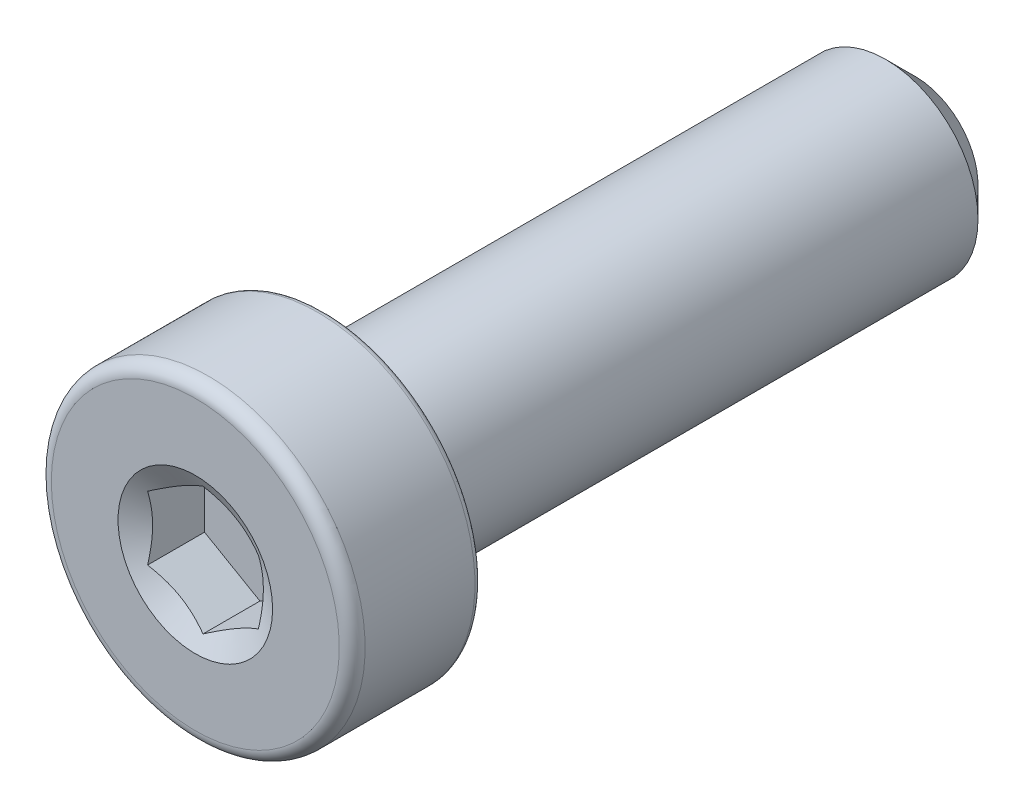
ISO-10303-21;
HEADER;
FILE_DESCRIPTION(('STEP AP214'),'2;1');
FILE_NAME('part.step','',(''),(''),'','','');
FILE_SCHEMA(('AUTOMOTIVE_DESIGN { 1 0 10303 214 1 1 1 1 }'));
ENDSEC;
DATA;
#1=APPLICATION_CONTEXT('core data for automotive mechanical design processes');
#2=APPLICATION_PROTOCOL_DEFINITION('international standard','automotive_design',2000,#1);
#3=PRODUCT_CONTEXT('',#1,'mechanical');
#4=PRODUCT('Part','Part','',(#3));
#5=PRODUCT_RELATED_PRODUCT_CATEGORY('part','',(#4));
#6=PRODUCT_DEFINITION_FORMATION('','',#4);
#7=PRODUCT_DEFINITION_CONTEXT('part definition',#1,'design');
#8=PRODUCT_DEFINITION('design','',#6,#7);
#9=PRODUCT_DEFINITION_SHAPE('','',#8);
#10=(LENGTH_UNIT() NAMED_UNIT(*) SI_UNIT(.MILLI.,.METRE.));
#11=(NAMED_UNIT(*) PLANE_ANGLE_UNIT() SI_UNIT($,.RADIAN.));
#12=(NAMED_UNIT(*) SI_UNIT($,.STERADIAN.) SOLID_ANGLE_UNIT());
#13=UNCERTAINTY_MEASURE_WITH_UNIT(LENGTH_MEASURE(1.E-05),#10,'distance_accuracy_value','');
#14=(GEOMETRIC_REPRESENTATION_CONTEXT(3) GLOBAL_UNCERTAINTY_ASSIGNED_CONTEXT((#13)) GLOBAL_UNIT_ASSIGNED_CONTEXT((#10,
#11,#12)) REPRESENTATION_CONTEXT('',''));
#15=CARTESIAN_POINT('',(0.,0.,0.));
#16=DIRECTION('',(0.,0.,1.));
#17=DIRECTION('',(1.,0.,0.));
#18=AXIS2_PLACEMENT_3D('',#15,#16,#17);
#19=CARTESIAN_POINT('',(0.,0.,-9.75));
#20=DIRECTION('',(0.,0.,-1.));
#21=DIRECTION('',(-1.,0.,0.));
#22=AXIS2_PLACEMENT_3D('',#19,#20,#21);
#23=PLANE('',#22);
#24=CARTESIAN_POINT('',(0.,0.,-9.75));
#25=DIRECTION('',(0.,0.,-1.));
#26=DIRECTION('',(-1.,0.,0.));
#27=AXIS2_PLACEMENT_3D('',#24,#25,#26);
#28=CIRCLE('',#27,1.7);
#29=CARTESIAN_POINT('',(-1.7,0.,-9.75));
#30=VERTEX_POINT('',#29);
#31=EDGE_CURVE('E48',#30,#30,#28,.T.);
#32=ORIENTED_EDGE('',*,*,#31,.T.);
#33=EDGE_LOOP('',(#32));
#34=FACE_BOUND('',#33,.T.);
#35=ADVANCED_FACE('F35',(#34),#23,.T.);
#36=CARTESIAN_POINT('',(0.,0.,-9.75));
#37=DIRECTION('',(0.,0.,1.));
#38=DIRECTION('',(1.,0.,0.));
#39=AXIS2_PLACEMENT_3D('',#36,#37,#38);
#40=CONICAL_SURFACE('',#39,1.7,0.785398163397449);
#41=CARTESIAN_POINT('',(0.,0.,-8.95));
#42=DIRECTION('',(0.,0.,-1.));
#43=DIRECTION('',(-1.,0.,0.));
#44=AXIS2_PLACEMENT_3D('',#41,#42,#43);
#45=CIRCLE('',#44,2.5);
#46=CARTESIAN_POINT('',(-2.5,0.,-8.95));
#47=VERTEX_POINT('',#46);
#48=EDGE_CURVE('E133',#47,#47,#45,.T.);
#49=ORIENTED_EDGE('',*,*,#48,.T.);
#50=EDGE_LOOP('',(#49));
#51=FACE_BOUND('',#50,.T.);
#52=ORIENTED_EDGE('',*,*,#31,.F.);
#53=EDGE_LOOP('',(#52));
#54=FACE_BOUND('',#53,.T.);
#55=ADVANCED_FACE('F139',(#51,#54),#40,.T.);
#56=CARTESIAN_POINT('',(0.,0.,-9.75));
#57=DIRECTION('',(0.,0.,-1.));
#58=DIRECTION('',(-1.,0.,0.));
#59=AXIS2_PLACEMENT_3D('',#56,#57,#58);
#60=CYLINDRICAL_SURFACE('',#59,2.5);
#61=CARTESIAN_POINT('',(0.,0.,6.25));
#62=DIRECTION('',(0.,0.,-1.));
#63=DIRECTION('',(-1.,0.,0.));
#64=AXIS2_PLACEMENT_3D('',#61,#62,#63);
#65=CIRCLE('',#64,2.5);
#66=CARTESIAN_POINT('',(-2.5,0.,6.25));
#67=VERTEX_POINT('',#66);
#68=EDGE_CURVE('E130',#67,#67,#65,.T.);
#69=ORIENTED_EDGE('',*,*,#68,.T.);
#70=EDGE_LOOP('',(#69));
#71=FACE_BOUND('',#70,.T.);
#72=ORIENTED_EDGE('',*,*,#48,.F.);
#73=EDGE_LOOP('',(#72));
#74=FACE_BOUND('',#73,.T.);
#75=ADVANCED_FACE('F141',(#71,#74),#60,.T.);
#76=CARTESIAN_POINT('',(0.,2.5,6.25));
#77=DIRECTION('',(0.,0.,-1.));
#78=DIRECTION('',(-1.,0.,0.));
#79=AXIS2_PLACEMENT_3D('',#76,#77,#78);
#80=PLANE('',#79);
#81=CARTESIAN_POINT('',(0.,0.,6.25));
#82=DIRECTION('',(0.,0.,-1.));
#83=DIRECTION('',(-1.,0.,0.));
#84=AXIS2_PLACEMENT_3D('',#81,#82,#83);
#85=CIRCLE('',#84,4.075);
#86=CARTESIAN_POINT('',(-4.075,0.,6.25));
#87=VERTEX_POINT('',#86);
#88=EDGE_CURVE('E127',#87,#87,#85,.T.);
#89=ORIENTED_EDGE('',*,*,#88,.T.);
#90=EDGE_LOOP('',(#89));
#91=FACE_BOUND('',#90,.T.);
#92=ORIENTED_EDGE('',*,*,#68,.F.);
#93=EDGE_LOOP('',(#92));
#94=FACE_BOUND('',#93,.T.);
#95=ADVANCED_FACE('F147',(#91,#94),#80,.T.);
#96=CARTESIAN_POINT('',(0.,0.,6.425));
#97=DIRECTION('',(0.,0.,-1.));
#98=DIRECTION('',(-1.,0.,0.));
#99=AXIS2_PLACEMENT_3D('',#96,#97,#98);
#100=TOROIDAL_SURFACE('',#99,4.075,0.175);
#101=CARTESIAN_POINT('',(0.,0.,6.425));
#102=DIRECTION('',(0.,0.,-1.));
#103=DIRECTION('',(-1.,0.,0.));
#104=AXIS2_PLACEMENT_3D('',#101,#102,#103);
#105=CIRCLE('',#104,4.25);
#106=CARTESIAN_POINT('',(-4.25,0.,6.425));
#107=VERTEX_POINT('',#106);
#108=EDGE_CURVE('E124',#107,#107,#105,.T.);
#109=ORIENTED_EDGE('',*,*,#108,.T.);
#110=EDGE_LOOP('',(#109));
#111=FACE_BOUND('',#110,.T.);
#112=ORIENTED_EDGE('',*,*,#88,.F.);
#113=EDGE_LOOP('',(#112));
#114=FACE_BOUND('',#113,.T.);
#115=ADVANCED_FACE('F153',(#111,#114),#100,.T.);
#116=CARTESIAN_POINT('',(0.,0.,-9.75));
#117=DIRECTION('',(0.,0.,-1.));
#118=DIRECTION('',(-1.,0.,0.));
#119=AXIS2_PLACEMENT_3D('',#116,#117,#118);
#120=CYLINDRICAL_SURFACE('',#119,4.25);
#121=CARTESIAN_POINT('',(0.,0.,9.4));
#122=DIRECTION('',(0.,0.,-1.));
#123=DIRECTION('',(-1.,0.,0.));
#124=AXIS2_PLACEMENT_3D('',#121,#122,#123);
#125=CIRCLE('',#124,4.25);
#126=CARTESIAN_POINT('',(-4.25,0.,9.4));
#127=VERTEX_POINT('',#126);
#128=EDGE_CURVE('E121',#127,#127,#125,.T.);
#129=ORIENTED_EDGE('',*,*,#128,.T.);
#130=EDGE_LOOP('',(#129));
#131=FACE_BOUND('',#130,.T.);
#132=ORIENTED_EDGE('',*,*,#108,.F.);
#133=EDGE_LOOP('',(#132));
#134=FACE_BOUND('',#133,.T.);
#135=ADVANCED_FACE('F157',(#131,#134),#120,.T.);
#136=CARTESIAN_POINT('',(0.,0.,9.4));
#137=DIRECTION('',(0.,0.,-1.));
#138=DIRECTION('',(-1.,0.,0.));
#139=AXIS2_PLACEMENT_3D('',#136,#137,#138);
#140=TOROIDAL_SURFACE('',#139,3.9,0.35);
#141=CARTESIAN_POINT('',(0.,0.,9.75));
#142=DIRECTION('',(0.,0.,-1.));
#143=DIRECTION('',(-1.,0.,0.));
#144=AXIS2_PLACEMENT_3D('',#141,#142,#143);
#145=CIRCLE('',#144,3.9);
#146=CARTESIAN_POINT('',(-3.9,0.,9.75));
#147=VERTEX_POINT('',#146);
#148=EDGE_CURVE('E118',#147,#147,#145,.T.);
#149=ORIENTED_EDGE('',*,*,#148,.T.);
#150=EDGE_LOOP('',(#149));
#151=FACE_BOUND('',#150,.T.);
#152=ORIENTED_EDGE('',*,*,#128,.F.);
#153=EDGE_LOOP('',(#152));
#154=FACE_BOUND('',#153,.T.);
#155=ADVANCED_FACE('F161',(#151,#154),#140,.T.);
#156=CARTESIAN_POINT('',(0.,3.9,9.75));
#157=DIRECTION('',(0.,0.,1.));
#158=DIRECTION('',(1.,0.,0.));
#159=AXIS2_PLACEMENT_3D('',#156,#157,#158);
#160=PLANE('',#159);
#161=CARTESIAN_POINT('',(0.,0.,9.75));
#162=DIRECTION('',(0.,0.,1.));
#163=DIRECTION('',(1.,0.,0.));
#164=AXIS2_PLACEMENT_3D('',#161,#162,#163);
#165=CIRCLE('',#164,2.09337567297406);
#166=CARTESIAN_POINT('',(2.09337567297406,0.,9.75));
#167=VERTEX_POINT('',#166);
#168=EDGE_CURVE('E255',#167,#167,#165,.T.);
#169=ORIENTED_EDGE('',*,*,#168,.F.);
#170=EDGE_LOOP('',(#169));
#171=FACE_BOUND('',#170,.T.);
#172=ORIENTED_EDGE('',*,*,#148,.F.);
#173=EDGE_LOOP('',(#172));
#174=FACE_BOUND('',#173,.T.);
#175=ADVANCED_FACE('F165',(#171,#174),#160,.T.);
#176=CARTESIAN_POINT('',(0.,0.,9.75));
#177=DIRECTION('',(0.,0.,1.));
#178=DIRECTION('',(1.,0.,0.));
#179=AXIS2_PLACEMENT_3D('',#176,#177,#178);
#180=CONICAL_SURFACE('',#179,2.09337567297406,1.0471975511966);
#181=ORIENTED_EDGE('',*,*,#168,.T.);
#182=EDGE_LOOP('',(#181));
#183=FACE_BOUND('',#182,.T.);
#184=CARTESIAN_POINT('',(1.5002,0.865909933730598,9.5414556650263));
#185=CARTESIAN_POINT('',(1.43428070889745,0.903968454193443,9.51947184824703));
#186=CARTESIAN_POINT('',(1.36779241087776,0.94235549095307,9.49947788115967));
#187=CARTESIAN_POINT('',(1.23366433933493,1.01979436916421,9.46457709266235));
#188=CARTESIAN_POINT('',(1.16602218135311,1.05884758728358,9.44968261980102));
#189=CARTESIAN_POINT('',(1.03157622213015,1.13646999803241,9.42649567278809));
#190=CARTESIAN_POINT('',(0.964793115072749,1.17502724286932,9.41804890318966));
#191=CARTESIAN_POINT('',(0.830912431610117,1.25232329150576,9.4079625689897));
#192=CARTESIAN_POINT('',(0.763815342295619,1.29106181408333,9.40631465483574));
#193=CARTESIAN_POINT('',(0.638425268170802,1.363455807133,9.40973061453095));
#194=CARTESIAN_POINT('',(0.580113576780178,1.39712207785428,9.41395575070183));
#195=CARTESIAN_POINT('',(0.463870120461215,1.46423526865157,9.42735076691052));
#196=CARTESIAN_POINT('',(0.405938758031212,1.49768195634505,9.4365252290937));
#197=CARTESIAN_POINT('',(0.289455348660845,1.56493368410116,9.45946217543284));
#198=CARTESIAN_POINT('',(0.230918055453305,1.59873020609216,9.47332195363929));
#199=CARTESIAN_POINT('',(0.114716876613637,1.6658189879754,9.5047787757145));
#200=CARTESIAN_POINT('',(0.0570515005961863,1.69911210834199,9.52236842136746));
#201=CARTESIAN_POINT('',(-0.000200000000003103,1.73216627762271,9.5414556650263));
#202=B_SPLINE_CURVE_WITH_KNOTS('',3,(#184,#185,#186,#187,#188,#189,#190,#191,#192,#193,#194,
#195,#196,#197,#198,#199,#200,#201),.UNSPECIFIED.,.F.,.F.,(4,2,2,2,2,2,2,2,4),(0.,
0.237777822177383,0.476127422841917,0.708577067230588,0.940741159251577,1.1429435283589,
1.34533342091875,1.55221450553907,1.75868901573748),.UNSPECIFIED.);
#203=CARTESIAN_POINT('',(1.5,0.866025403784436,9.54138899169341));
#204=VERTEX_POINT('',#203);
#205=CARTESIAN_POINT('',(0.,1.73205080756887,9.54138899169341));
#206=VERTEX_POINT('',#205);
#207=EDGE_CURVE('E102',#204,#206,#202,.T.);
#208=ORIENTED_EDGE('',*,*,#207,.F.);
#209=CARTESIAN_POINT('',(1.5,-2.28946890925631,10.121649295826));
#210=CARTESIAN_POINT('',(1.5,-2.22422955711001,10.0901521310091));
#211=CARTESIAN_POINT('',(1.5,-2.15883649737623,10.0589680101354));
#212=CARTESIAN_POINT('',(1.5,-2.02766070628189,9.99740257185953));
#213=CARTESIAN_POINT('',(1.5,-1.9618779118326,9.96702138903554));
#214=CARTESIAN_POINT('',(1.5,-1.82948367590071,9.907077827651));
#215=CARTESIAN_POINT('',(1.5,-1.76286964590902,9.87752114149355));
#216=CARTESIAN_POINT('',(1.5,-1.62909941599885,9.81966908411551));
#217=CARTESIAN_POINT('',(1.5,-1.56194324309754,9.79137365049432));
#218=CARTESIAN_POINT('',(1.5,-1.42500619524527,9.73557186598219));
#219=CARTESIAN_POINT('',(1.5,-1.35520588699246,9.70811258401843));
#220=CARTESIAN_POINT('',(1.5,-1.21478957942829,9.65537265073154));
#221=CARTESIAN_POINT('',(1.5,-1.14417348125658,9.63009226666336));
#222=CARTESIAN_POINT('',(1.5,-0.931191801085829,9.55853146254348));
#223=CARTESIAN_POINT('',(1.5,-0.78732497371264,9.51637475335477));
#224=CARTESIAN_POINT('',(1.5,-0.568772700575271,9.46678689450771));
#225=CARTESIAN_POINT('',(1.5,-0.495640345793815,9.45254991631158));
#226=CARTESIAN_POINT('',(1.5,-0.348502307838471,9.4295406040777));
#227=CARTESIAN_POINT('',(1.5,-0.274496701711071,9.42076779155903));
#228=CARTESIAN_POINT('',(1.5,-0.126935601798651,9.40949855709945));
#229=CARTESIAN_POINT('',(1.5,-0.0533862078859922,9.40692435065547));
#230=CARTESIAN_POINT('',(1.5,0.0936622716385084,9.40806052572912));
#231=CARTESIAN_POINT('',(1.5,0.167161354670854,9.41177120839138));
#232=CARTESIAN_POINT('',(1.5,0.3456803821271,9.42808971368353));
#233=CARTESIAN_POINT('',(1.5,0.450410514958657,9.44388185355354));
#234=CARTESIAN_POINT('',(1.5,0.657891969531223,9.48536431192958));
#235=CARTESIAN_POINT('',(1.5,0.760641207833833,9.5110645123585));
#236=CARTESIAN_POINT('',(1.5,0.966381168392539,9.57026308478443));
#237=CARTESIAN_POINT('',(1.5,1.06932296555729,9.60392740339232));
#238=CARTESIAN_POINT('',(1.5,1.22230709351192,9.65829438908344));
#239=CARTESIAN_POINT('',(1.5,1.27305783511732,9.67705937268821));
#240=CARTESIAN_POINT('',(1.5,1.3741450115088,9.71567408725896));
#241=CARTESIAN_POINT('',(1.5,1.42448145444113,9.73552379683731));
#242=CARTESIAN_POINT('',(1.5,1.55744748680979,9.789340075099));
#243=CARTESIAN_POINT('',(1.5,1.63976225916663,9.82408262117661));
#244=CARTESIAN_POINT('',(1.5,1.80359465969967,9.89540460375299));
#245=CARTESIAN_POINT('',(1.5,1.88511221645997,9.9319842030495));
#246=CARTESIAN_POINT('',(1.5,2.12875959775541,10.0438112389649));
#247=CARTESIAN_POINT('',(1.5,2.28993757004672,10.1211274275682));
#248=CARTESIAN_POINT('',(1.5,2.61086725627019,10.2791741391286));
#249=CARTESIAN_POINT('',(1.5,2.77061667904916,10.3599092539195));
#250=CARTESIAN_POINT('',(1.5,3.08897798625638,10.5235199736269));
#251=CARTESIAN_POINT('',(1.5,3.24759006455736,10.606395202095));
#252=CARTESIAN_POINT('',(1.5,3.5480498977071,10.7651540242879));
#253=CARTESIAN_POINT('',(1.5,3.68997184700446,10.8408977245038));
#254=CARTESIAN_POINT('',(1.5,3.97335824337872,10.9932529754136));
#255=CARTESIAN_POINT('',(1.5,4.11482266639993,11.0698645708157));
#256=CARTESIAN_POINT('',(1.5,4.39699015625816,11.2235102288952));
#257=CARTESIAN_POINT('',(1.5,4.53769424143924,11.300542423984));
#258=CARTESIAN_POINT('',(1.5,4.81881695253546,11.4551037850255));
#259=CARTESIAN_POINT('',(1.5,4.95923559704223,11.5326329171499));
#260=CARTESIAN_POINT('',(1.5,5.09955320664059,11.6103433688583));
#261=B_SPLINE_CURVE_WITH_KNOTS('',3,(#209,#210,#211,#212,#213,#214,#215,#216,#217,#218,#219,
#220,#221,#222,#223,#224,#225,#226,#227,#228,#229,#230,#231,#232,#233,#234,#235,#236,#237,#238,
#239,#240,#241,#242,#243,#244,#245,#246,#247,#248,#249,#250,#251,#252,#253,#254,#255,#256,#257,
#258,#259,#260),.UNSPECIFIED.,.F.,.F.,(4,2,2,2,2,2,2,2,2,2,2,2,2,2,2,2,2,2,2,2,2,2,2,2,2,4),(0.,
0.217336850893779,0.434709900924588,0.653329085678124,0.871937442191075,1.09692037438618,
1.32193086293911,1.77075409579344,1.99410639403826,2.21743913122937,2.43795438114542,
2.65848019749464,2.97556672594526,3.29297032602481,3.61768304073655,3.78000129827247,
3.94231635651881,4.2103230246926,4.47835348539217,5.01456574112281,5.55152254280808,
6.0883855280323,6.5709902154558,7.05361987753442,7.53485095488151,8.01604961375129),.UNSPECIFIED.);
#262=CARTESIAN_POINT('',(1.5,-0.866025403784437,9.54138899169341));
#263=VERTEX_POINT('',#262);
#264=EDGE_CURVE('E211',#263,#204,#261,.T.);
#265=ORIENTED_EDGE('',*,*,#264,.F.);
#266=CARTESIAN_POINT('',(-0.000200000000001783,-1.73216627762271,9.5414556650263));
#267=CARTESIAN_POINT('',(0.0657192911025457,-1.69410775715987,9.51947184824703));
#268=CARTESIAN_POINT('',(0.132207589122233,-1.65572072040024,9.49947788115967));
#269=CARTESIAN_POINT('',(0.266335660665068,-1.5782818421891,9.46457709266236));
#270=CARTESIAN_POINT('',(0.333977818646884,-1.53922862406973,9.44968261980102));
#271=CARTESIAN_POINT('',(0.468423777869841,-1.4616062133209,9.42649567278809));
#272=CARTESIAN_POINT('',(0.535206884927245,-1.42304896848399,9.41804890318966));
#273=CARTESIAN_POINT('',(0.669087568389878,-1.34575291984755,9.4079625689897));
#274=CARTESIAN_POINT('',(0.736184657704376,-1.30701439726998,9.40631465483574));
#275=CARTESIAN_POINT('',(0.861574731829192,-1.23462040422031,9.40973061453095));
#276=CARTESIAN_POINT('',(0.919886423219816,-1.20095413349903,9.41395575070183));
#277=CARTESIAN_POINT('',(1.03612987953878,-1.13384094270174,9.42735076691052));
#278=CARTESIAN_POINT('',(1.09406124196878,-1.10039425500826,9.4365252290937));
#279=CARTESIAN_POINT('',(1.21054465133915,-1.03314252725215,9.45946217543284));
#280=CARTESIAN_POINT('',(1.26908194454669,-0.99934600526115,9.47332195363929));
#281=CARTESIAN_POINT('',(1.38528312338636,-0.932257223377916,9.5047787757145));
#282=CARTESIAN_POINT('',(1.44294849940381,-0.89896410301132,9.52236842136746));
#283=CARTESIAN_POINT('',(1.5002,-0.865909933730599,9.5414556650263));
#284=B_SPLINE_CURVE_WITH_KNOTS('',3,(#266,#267,#268,#269,#270,#271,#272,#273,#274,#275,#276,
#277,#278,#279,#280,#281,#282,#283),.UNSPECIFIED.,.F.,.F.,(4,2,2,2,2,2,2,2,4),(0.,
0.237777822177383,0.476127422841918,0.708577067230589,0.940741159251579,1.1429435283589,
1.34533342091875,1.55221450553907,1.75868901573748),.UNSPECIFIED.);
#285=CARTESIAN_POINT('',(0.,-1.73205080756888,9.54138899169341));
#286=VERTEX_POINT('',#285);
#287=EDGE_CURVE('E205',#286,#263,#284,.T.);
#288=ORIENTED_EDGE('',*,*,#287,.F.);
#289=CARTESIAN_POINT('',(-1.5002,-0.865909933730601,9.5414556650263));
#290=CARTESIAN_POINT('',(-1.43428070889745,-0.903968454193446,9.51947184824703));
#291=CARTESIAN_POINT('',(-1.36779241087776,-0.942355490953073,9.49947788115967));
#292=CARTESIAN_POINT('',(-1.23366433933493,-1.01979436916421,9.46457709266236));
#293=CARTESIAN_POINT('',(-1.16602218135311,-1.05884758728358,9.44968261980102));
#294=CARTESIAN_POINT('',(-1.03157622213015,-1.13646999803241,9.42649567278809));
#295=CARTESIAN_POINT('',(-0.96479311507275,-1.17502724286933,9.41804890318967));
#296=CARTESIAN_POINT('',(-0.830912431610117,-1.25232329150577,9.4079625689897));
#297=CARTESIAN_POINT('',(-0.763815342295619,-1.29106181408333,9.40631465483574));
#298=CARTESIAN_POINT('',(-0.638425268170803,-1.363455807133,9.40973061453096));
#299=CARTESIAN_POINT('',(-0.580113576780179,-1.39712207785428,9.41395575070183));
#300=CARTESIAN_POINT('',(-0.463870120461216,-1.46423526865157,9.42735076691052));
#301=CARTESIAN_POINT('',(-0.405938758031214,-1.49768195634505,9.4365252290937));
#302=CARTESIAN_POINT('',(-0.289455348660848,-1.56493368410116,9.45946217543285));
#303=CARTESIAN_POINT('',(-0.230918055453309,-1.59873020609216,9.4733219536393));
#304=CARTESIAN_POINT('',(-0.114716876613641,-1.6658189879754,9.50477877571451));
#305=CARTESIAN_POINT('',(-0.0570515005961911,-1.69911210834199,9.52236842136747));
#306=CARTESIAN_POINT('',(0.000199999999998025,-1.73216627762271,9.5414556650263));
#307=B_SPLINE_CURVE_WITH_KNOTS('',3,(#289,#290,#291,#292,#293,#294,#295,#296,#297,#298,#299,
#300,#301,#302,#303,#304,#305,#306),.UNSPECIFIED.,.F.,.F.,(4,2,2,2,2,2,2,2,4),(0.,
0.237777822177383,0.476127422841918,0.708577067230589,0.940741159251579,1.1429435283589,
1.34533342091875,1.55221450553907,1.75868901573747),.UNSPECIFIED.);
#308=CARTESIAN_POINT('',(-1.5,-0.866025403784439,9.54138899169341));
#309=VERTEX_POINT('',#308);
#310=EDGE_CURVE('E55',#309,#286,#307,.T.);
#311=ORIENTED_EDGE('',*,*,#310,.F.);
#312=CARTESIAN_POINT('',(-1.5,-2.28946890925632,10.121649295826));
#313=CARTESIAN_POINT('',(-1.5,-2.22422955711001,10.0901521310091));
#314=CARTESIAN_POINT('',(-1.5,-2.15883649737623,10.0589680101354));
#315=CARTESIAN_POINT('',(-1.5,-2.02766070628189,9.99740257185953));
#316=CARTESIAN_POINT('',(-1.5,-1.9618779118326,9.96702138903554));
#317=CARTESIAN_POINT('',(-1.5,-1.82948367590071,9.907077827651));
#318=CARTESIAN_POINT('',(-1.5,-1.76286964590902,9.87752114149355));
#319=CARTESIAN_POINT('',(-1.5,-1.62909941599885,9.81966908411552));
#320=CARTESIAN_POINT('',(-1.5,-1.56194324309754,9.79137365049433));
#321=CARTESIAN_POINT('',(-1.5,-1.42500619524527,9.73557186598219));
#322=CARTESIAN_POINT('',(-1.5,-1.35520588699246,9.70811258401843));
#323=CARTESIAN_POINT('',(-1.5,-1.21478957942829,9.65537265073154));
#324=CARTESIAN_POINT('',(-1.5,-1.14417348125658,9.63009226666336));
#325=CARTESIAN_POINT('',(-1.5,-0.931191801085829,9.55853146254348));
#326=CARTESIAN_POINT('',(-1.5,-0.787324973712641,9.51637475335477));
#327=CARTESIAN_POINT('',(-1.5,-0.568772700575272,9.46678689450771));
#328=CARTESIAN_POINT('',(-1.5,-0.495640345793815,9.45254991631159));
#329=CARTESIAN_POINT('',(-1.5,-0.348502307838472,9.4295406040777));
#330=CARTESIAN_POINT('',(-1.5,-0.274496701711071,9.42076779155903));
#331=CARTESIAN_POINT('',(-1.5,-0.126935601798652,9.40949855709945));
#332=CARTESIAN_POINT('',(-1.5,-0.0533862078859932,9.40692435065547));
#333=CARTESIAN_POINT('',(-1.5,0.0936622716385074,9.40806052572913));
#334=CARTESIAN_POINT('',(-1.5,0.167161354670853,9.41177120839138));
#335=CARTESIAN_POINT('',(-1.5,0.345680382127099,9.42808971368353));
#336=CARTESIAN_POINT('',(-1.5,0.450410514958656,9.44388185355354));
#337=CARTESIAN_POINT('',(-1.5,0.657891969531223,9.48536431192959));
#338=CARTESIAN_POINT('',(-1.5,0.760641207833833,9.5110645123585));
#339=CARTESIAN_POINT('',(-1.5,0.96638116839254,9.57026308478444));
#340=CARTESIAN_POINT('',(-1.5,1.06932296555729,9.60392740339232));
#341=CARTESIAN_POINT('',(-1.5,1.22230709351192,9.65829438908344));
#342=CARTESIAN_POINT('',(-1.5,1.27305783511733,9.67705937268821));
#343=CARTESIAN_POINT('',(-1.5,1.3741450115088,9.71567408725896));
#344=CARTESIAN_POINT('',(-1.5,1.42448145444114,9.73552379683731));
#345=CARTESIAN_POINT('',(-1.5,1.55744748680979,9.789340075099));
#346=CARTESIAN_POINT('',(-1.5,1.63976225916663,9.82408262117661));
#347=CARTESIAN_POINT('',(-1.5,1.80359465969967,9.89540460375299));
#348=CARTESIAN_POINT('',(-1.5,1.88511221645997,9.9319842030495));
#349=CARTESIAN_POINT('',(-1.5,2.12875959775541,10.0438112389649));
#350=CARTESIAN_POINT('',(-1.5,2.28993757004672,10.1211274275682));
#351=CARTESIAN_POINT('',(-1.5,2.61086725627019,10.2791741391286));
#352=CARTESIAN_POINT('',(-1.5,2.77061667904916,10.3599092539195));
#353=CARTESIAN_POINT('',(-1.5,3.08897798625638,10.5235199736269));
#354=CARTESIAN_POINT('',(-1.5,3.24759006455736,10.6063952020951));
#355=CARTESIAN_POINT('',(-1.5,3.5480498977071,10.7651540242879));
#356=CARTESIAN_POINT('',(-1.5,3.68997184700446,10.8408977245038));
#357=CARTESIAN_POINT('',(-1.5,3.97335824337872,10.9932529754136));
#358=CARTESIAN_POINT('',(-1.5,4.11482266639993,11.0698645708157));
#359=CARTESIAN_POINT('',(-1.5,4.39699015625816,11.2235102288953));
#360=CARTESIAN_POINT('',(-1.5,4.53769424143925,11.300542423984));
#361=CARTESIAN_POINT('',(-1.5,4.81881695253546,11.4551037850255));
#362=CARTESIAN_POINT('',(-1.5,4.95923559704223,11.5326329171499));
#363=CARTESIAN_POINT('',(-1.5,5.0995532066406,11.6103433688583));
#364=B_SPLINE_CURVE_WITH_KNOTS('',3,(#312,#313,#314,#315,#316,#317,#318,#319,#320,#321,#322,
#323,#324,#325,#326,#327,#328,#329,#330,#331,#332,#333,#334,#335,#336,#337,#338,#339,#340,#341,
#342,#343,#344,#345,#346,#347,#348,#349,#350,#351,#352,#353,#354,#355,#356,#357,#358,#359,#360,
#361,#362,#363),.UNSPECIFIED.,.F.,.F.,(4,2,2,2,2,2,2,2,2,2,2,2,2,2,2,2,2,2,2,2,2,2,2,2,2,4),(0.,
0.217336850893778,0.434709900924588,0.653329085678124,0.871937442191075,1.09692037438618,
1.32193086293911,1.77075409579344,1.99410639403826,2.21743913122937,2.43795438114542,
2.65848019749464,2.97556672594526,3.29297032602481,3.61768304073656,3.78000129827248,
3.94231635651881,4.2103230246926,4.47835348539217,5.01456574112281,5.55152254280809,
6.0883855280323,6.5709902154558,7.05361987753443,7.53485095488151,8.0160496137513),.UNSPECIFIED.);
#365=CARTESIAN_POINT('',(-1.5,0.866025403784437,9.54138899169341));
#366=VERTEX_POINT('',#365);
#367=EDGE_CURVE('E11',#366,#309,#364,.F.);
#368=ORIENTED_EDGE('',*,*,#367,.F.);
#369=CARTESIAN_POINT('',(0.000199999999996574,1.73216627762271,9.5414556650263));
#370=CARTESIAN_POINT('',(-0.0657192911025506,1.69410775715987,9.51947184824703));
#371=CARTESIAN_POINT('',(-0.132207589122238,1.65572072040024,9.49947788115967));
#372=CARTESIAN_POINT('',(-0.266335660665073,1.5782818421891,9.46457709266236));
#373=CARTESIAN_POINT('',(-0.333977818646889,1.53922862406973,9.44968261980102));
#374=CARTESIAN_POINT('',(-0.468423777869845,1.4616062133209,9.42649567278809));
#375=CARTESIAN_POINT('',(-0.53520688492725,1.42304896848399,9.41804890318967));
#376=CARTESIAN_POINT('',(-0.669087568389882,1.34575291984755,9.4079625689897));
#377=CARTESIAN_POINT('',(-0.73618465770438,1.30701439726998,9.40631465483574));
#378=CARTESIAN_POINT('',(-0.861574731829196,1.23462040422031,9.40973061453096));
#379=CARTESIAN_POINT('',(-0.91988642321982,1.20095413349903,9.41395575070183));
#380=CARTESIAN_POINT('',(-1.03612987953878,1.13384094270174,9.42735076691052));
#381=CARTESIAN_POINT('',(-1.09406124196879,1.10039425500826,9.4365252290937));
#382=CARTESIAN_POINT('',(-1.21054465133915,1.03314252725216,9.45946217543285));
#383=CARTESIAN_POINT('',(-1.26908194454669,0.99934600526115,9.4733219536393));
#384=CARTESIAN_POINT('',(-1.38528312338636,0.932257223377916,9.50477877571451));
#385=CARTESIAN_POINT('',(-1.44294849940381,0.89896410301132,9.52236842136747));
#386=CARTESIAN_POINT('',(-1.5002,0.8659099337306,9.5414556650263));
#387=B_SPLINE_CURVE_WITH_KNOTS('',3,(#369,#370,#371,#372,#373,#374,#375,#376,#377,#378,#379,
#380,#381,#382,#383,#384,#385,#386),.UNSPECIFIED.,.F.,.F.,(4,2,2,2,2,2,2,2,4),(0.,
0.237777822177382,0.476127422841917,0.708577067230588,0.940741159251577,1.1429435283589,
1.34533342091875,1.55221450553906,1.75868901573747),.UNSPECIFIED.);
#388=EDGE_CURVE('E93',#206,#366,#387,.T.);
#389=ORIENTED_EDGE('',*,*,#388,.F.);
#390=EDGE_LOOP('',(#208,#265,#288,#311,#368,#389));
#391=FACE_BOUND('',#390,.T.);
#392=ADVANCED_FACE('F92',(#183,#391),#180,.F.);
#393=CARTESIAN_POINT('',(0.,0.,8.));
#394=DIRECTION('',(0.,0.,1.));
#395=DIRECTION('',(1.,0.,0.));
#396=AXIS2_PLACEMENT_3D('',#393,#394,#395);
#397=PLANE('',#396);
#398=DIRECTION('',(-0.866025403784439,-0.5,0.));
#399=VECTOR('',#398,1.);
#400=CARTESIAN_POINT('',(0.,1.73205080756887,8.));
#401=LINE('',#400,#399);
#402=CARTESIAN_POINT('',(0.,1.73205080756887,8.));
#403=VERTEX_POINT('',#402);
#404=CARTESIAN_POINT('',(-1.5,0.866025403784438,8.));
#405=VERTEX_POINT('',#404);
#406=EDGE_CURVE('E101',#403,#405,#401,.T.);
#407=ORIENTED_EDGE('',*,*,#406,.T.);
#408=DIRECTION('',(0.,-1.,0.));
#409=VECTOR('',#408,1.);
#410=CARTESIAN_POINT('',(-1.5,0.866025403784438,8.));
#411=LINE('',#410,#409);
#412=CARTESIAN_POINT('',(-1.5,-0.866025403784439,8.));
#413=VERTEX_POINT('',#412);
#414=EDGE_CURVE('E106',#405,#413,#411,.T.);
#415=ORIENTED_EDGE('',*,*,#414,.T.);
#416=DIRECTION('',(0.866025403784439,-0.5,0.));
#417=VECTOR('',#416,1.);
#418=CARTESIAN_POINT('',(-1.5,-0.866025403784439,8.));
#419=LINE('',#418,#417);
#420=CARTESIAN_POINT('',(0.,-1.73205080756888,8.));
#421=VERTEX_POINT('',#420);
#422=EDGE_CURVE('E237',#413,#421,#419,.T.);
#423=ORIENTED_EDGE('',*,*,#422,.T.);
#424=DIRECTION('',(0.866025403784438,0.5,0.));
#425=VECTOR('',#424,1.);
#426=CARTESIAN_POINT('',(0.,-1.73205080756888,8.));
#427=LINE('',#426,#425);
#428=CARTESIAN_POINT('',(1.5,-0.866025403784437,8.));
#429=VERTEX_POINT('',#428);
#430=EDGE_CURVE('E241',#421,#429,#427,.T.);
#431=ORIENTED_EDGE('',*,*,#430,.T.);
#432=DIRECTION('',(0.,1.,0.));
#433=VECTOR('',#432,1.);
#434=CARTESIAN_POINT('',(1.5,-0.866025403784437,8.));
#435=LINE('',#434,#433);
#436=CARTESIAN_POINT('',(1.5,0.866025403784436,8.));
#437=VERTEX_POINT('',#436);
#438=EDGE_CURVE('E114',#429,#437,#435,.T.);
#439=ORIENTED_EDGE('',*,*,#438,.T.);
#440=DIRECTION('',(-0.866025403784439,0.5,0.));
#441=VECTOR('',#440,1.);
#442=CARTESIAN_POINT('',(1.5,0.866025403784436,8.));
#443=LINE('',#442,#441);
#444=EDGE_CURVE('E109',#437,#403,#443,.T.);
#445=ORIENTED_EDGE('',*,*,#444,.T.);
#446=EDGE_LOOP('',(#407,#415,#423,#431,#439,#445));
#447=FACE_BOUND('',#446,.T.);
#448=ADVANCED_FACE('F191',(#447),#397,.T.);
#449=CARTESIAN_POINT('',(-1.5,0.866025403784438,8.));
#450=DIRECTION('',(-1.,0.,0.));
#451=DIRECTION('',(0.,-1.,0.));
#452=AXIS2_PLACEMENT_3D('',#449,#450,#451);
#453=PLANE('',#452);
#454=DIRECTION('',(0.,0.,1.));
#455=VECTOR('',#454,1.);
#456=CARTESIAN_POINT('',(-1.5,0.866025403784438,8.));
#457=LINE('',#456,#455);
#458=EDGE_CURVE('E99',#405,#366,#457,.T.);
#459=ORIENTED_EDGE('',*,*,#458,.T.);
#460=ORIENTED_EDGE('',*,*,#367,.T.);
#461=DIRECTION('',(0.,0.,1.));
#462=VECTOR('',#461,1.);
#463=CARTESIAN_POINT('',(-1.5,-0.866025403784439,8.));
#464=LINE('',#463,#462);
#465=EDGE_CURVE('E108',#413,#309,#464,.T.);
#466=ORIENTED_EDGE('',*,*,#465,.F.);
#467=ORIENTED_EDGE('',*,*,#414,.F.);
#468=EDGE_LOOP('',(#459,#460,#466,#467));
#469=FACE_BOUND('',#468,.T.);
#470=ADVANCED_FACE('F104',(#469),#453,.F.);
#471=CARTESIAN_POINT('',(-1.5,-0.866025403784439,8.));
#472=DIRECTION('',(-0.5,-0.866025403784439,0.));
#473=DIRECTION('',(0.866025403784439,-0.5,0.));
#474=AXIS2_PLACEMENT_3D('',#471,#472,#473);
#475=PLANE('',#474);
#476=ORIENTED_EDGE('',*,*,#465,.T.);
#477=ORIENTED_EDGE('',*,*,#310,.T.);
#478=DIRECTION('',(0.,0.,1.));
#479=VECTOR('',#478,1.);
#480=CARTESIAN_POINT('',(0.,-1.73205080756888,8.));
#481=LINE('',#480,#479);
#482=EDGE_CURVE('E111',#421,#286,#481,.T.);
#483=ORIENTED_EDGE('',*,*,#482,.F.);
#484=ORIENTED_EDGE('',*,*,#422,.F.);
#485=EDGE_LOOP('',(#476,#477,#483,#484));
#486=FACE_BOUND('',#485,.T.);
#487=ADVANCED_FACE('F226',(#486),#475,.F.);
#488=CARTESIAN_POINT('',(0.,-1.73205080756888,8.));
#489=DIRECTION('',(0.5,-0.866025403784438,0.));
#490=DIRECTION('',(0.866025403784438,0.5,0.));
#491=AXIS2_PLACEMENT_3D('',#488,#489,#490);
#492=PLANE('',#491);
#493=ORIENTED_EDGE('',*,*,#482,.T.);
#494=ORIENTED_EDGE('',*,*,#287,.T.);
#495=DIRECTION('',(0.,0.,1.));
#496=VECTOR('',#495,1.);
#497=CARTESIAN_POINT('',(1.5,-0.866025403784437,8.));
#498=LINE('',#497,#496);
#499=EDGE_CURVE('E251',#429,#263,#498,.T.);
#500=ORIENTED_EDGE('',*,*,#499,.F.);
#501=ORIENTED_EDGE('',*,*,#430,.F.);
#502=EDGE_LOOP('',(#493,#494,#500,#501));
#503=FACE_BOUND('',#502,.T.);
#504=ADVANCED_FACE('F221',(#503),#492,.F.);
#505=CARTESIAN_POINT('',(1.5,-0.866025403784437,8.));
#506=DIRECTION('',(1.,0.,0.));
#507=DIRECTION('',(0.,0.,-1.));
#508=AXIS2_PLACEMENT_3D('',#505,#506,#507);
#509=PLANE('',#508);
#510=ORIENTED_EDGE('',*,*,#499,.T.);
#511=ORIENTED_EDGE('',*,*,#264,.T.);
#512=DIRECTION('',(0.,0.,1.));
#513=VECTOR('',#512,1.);
#514=CARTESIAN_POINT('',(1.5,0.866025403784436,8.));
#515=LINE('',#514,#513);
#516=EDGE_CURVE('E248',#437,#204,#515,.T.);
#517=ORIENTED_EDGE('',*,*,#516,.F.);
#518=ORIENTED_EDGE('',*,*,#438,.F.);
#519=EDGE_LOOP('',(#510,#511,#517,#518));
#520=FACE_BOUND('',#519,.T.);
#521=ADVANCED_FACE('F218',(#520),#509,.F.);
#522=CARTESIAN_POINT('',(1.5,0.866025403784436,8.));
#523=DIRECTION('',(0.5,0.866025403784439,0.));
#524=DIRECTION('',(-0.866025403784439,0.5,0.));
#525=AXIS2_PLACEMENT_3D('',#522,#523,#524);
#526=PLANE('',#525);
#527=ORIENTED_EDGE('',*,*,#516,.T.);
#528=ORIENTED_EDGE('',*,*,#207,.T.);
#529=DIRECTION('',(0.,0.,1.));
#530=VECTOR('',#529,1.);
#531=CARTESIAN_POINT('',(0.,1.73205080756887,8.));
#532=LINE('',#531,#530);
#533=EDGE_CURVE('E62',#403,#206,#532,.T.);
#534=ORIENTED_EDGE('',*,*,#533,.F.);
#535=ORIENTED_EDGE('',*,*,#444,.F.);
#536=EDGE_LOOP('',(#527,#528,#534,#535));
#537=FACE_BOUND('',#536,.T.);
#538=ADVANCED_FACE('F172',(#537),#526,.F.);
#539=CARTESIAN_POINT('',(0.,1.73205080756887,8.));
#540=DIRECTION('',(-0.5,0.866025403784439,0.));
#541=DIRECTION('',(-0.866025403784439,-0.5,0.));
#542=AXIS2_PLACEMENT_3D('',#539,#540,#541);
#543=PLANE('',#542);
#544=ORIENTED_EDGE('',*,*,#533,.T.);
#545=ORIENTED_EDGE('',*,*,#388,.T.);
#546=ORIENTED_EDGE('',*,*,#458,.F.);
#547=ORIENTED_EDGE('',*,*,#406,.F.);
#548=EDGE_LOOP('',(#544,#545,#546,#547));
#549=FACE_BOUND('',#548,.T.);
#550=ADVANCED_FACE('F98',(#549),#543,.F.);
#551=CLOSED_SHELL('',(#35,#55,#75,#95,#115,#135,#155,#175,#392,#448,#470,#487,#504,#521,#538,#550));
#552=MANIFOLD_SOLID_BREP('B2',#551);
#553=ADVANCED_BREP_SHAPE_REPRESENTATION('',(#18,#552),#14);
#554=SHAPE_DEFINITION_REPRESENTATION(#9,#553);
ENDSEC;
END-ISO-10303-21;
